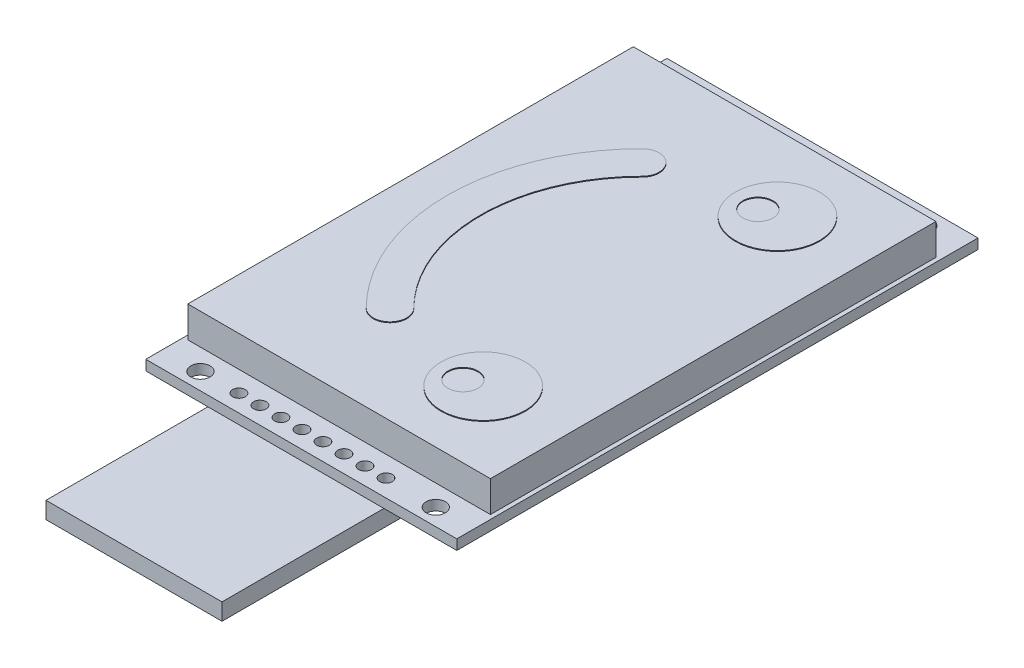
ISO-10303-21;
HEADER;
FILE_DESCRIPTION(('STEP AP214'),'2;1');
FILE_NAME('part.step','',(''),(''),'','','');
FILE_SCHEMA(('AUTOMOTIVE_DESIGN { 1 0 10303 214 1 1 1 1 }'));
ENDSEC;
DATA;
#1=APPLICATION_CONTEXT('core data for automotive mechanical design processes');
#2=APPLICATION_PROTOCOL_DEFINITION('international standard','automotive_design',2000,#1);
#3=PRODUCT_CONTEXT('',#1,'mechanical');
#4=PRODUCT('Part','Part','',(#3));
#5=PRODUCT_RELATED_PRODUCT_CATEGORY('part','',(#4));
#6=PRODUCT_DEFINITION_FORMATION('','',#4);
#7=PRODUCT_DEFINITION_CONTEXT('part definition',#1,'design');
#8=PRODUCT_DEFINITION('design','',#6,#7);
#9=PRODUCT_DEFINITION_SHAPE('','',#8);
#10=(LENGTH_UNIT() NAMED_UNIT(*) SI_UNIT(.MILLI.,.METRE.));
#11=(NAMED_UNIT(*) PLANE_ANGLE_UNIT() SI_UNIT($,.RADIAN.));
#12=(NAMED_UNIT(*) SI_UNIT($,.STERADIAN.) SOLID_ANGLE_UNIT());
#13=UNCERTAINTY_MEASURE_WITH_UNIT(LENGTH_MEASURE(1.E-05),#10,'distance_accuracy_value','');
#14=(GEOMETRIC_REPRESENTATION_CONTEXT(3) GLOBAL_UNCERTAINTY_ASSIGNED_CONTEXT((#13)) GLOBAL_UNIT_ASSIGNED_CONTEXT((#10,
#11,#12)) REPRESENTATION_CONTEXT('',''));
#15=CARTESIAN_POINT('',(0.,0.,0.));
#16=DIRECTION('',(0.,0.,1.));
#17=DIRECTION('',(1.,0.,0.));
#18=AXIS2_PLACEMENT_3D('',#15,#16,#17);
#19=CARTESIAN_POINT('',(0.,4.9,0.));
#20=DIRECTION('',(0.,1.,0.));
#21=DIRECTION('',(0.,0.,1.));
#22=AXIS2_PLACEMENT_3D('',#19,#20,#21);
#23=PLANE('',#22);
#24=CARTESIAN_POINT('',(26.6398842221222,4.9,-13.5));
#25=DIRECTION('',(0.,1.,0.));
#26=DIRECTION('',(0.,0.,1.));
#27=AXIS2_PLACEMENT_3D('',#24,#25,#26);
#28=CIRCLE('',#27,5.);
#29=CARTESIAN_POINT('',(26.6398842221222,4.9,-8.5));
#30=VERTEX_POINT('',#29);
#31=EDGE_CURVE('E216',#30,#30,#28,.T.);
#32=ORIENTED_EDGE('',*,*,#31,.F.);
#33=EDGE_LOOP('',(#32));
#34=FACE_BOUND('',#33,.T.);
#35=CARTESIAN_POINT('',(26.6398842221222,4.9,-48.5));
#36=DIRECTION('',(0.,1.,0.));
#37=DIRECTION('',(0.,0.,1.));
#38=AXIS2_PLACEMENT_3D('',#35,#36,#37);
#39=CIRCLE('',#38,5.);
#40=CARTESIAN_POINT('',(26.6398842221222,4.9,-43.5));
#41=VERTEX_POINT('',#40);
#42=EDGE_CURVE('E227',#41,#41,#39,.T.);
#43=ORIENTED_EDGE('',*,*,#42,.F.);
#44=EDGE_LOOP('',(#43));
#45=FACE_BOUND('',#44,.T.);
#46=DIRECTION('',(0.,0.,1.));
#47=VECTOR('',#46,1.);
#48=CARTESIAN_POINT('',(0.499999999999989,4.9,-57.5));
#49=LINE('',#48,#47);
#50=CARTESIAN_POINT('',(0.499999999999989,4.9,-57.5));
#51=VERTEX_POINT('',#50);
#52=CARTESIAN_POINT('',(0.500000000000007,4.9,-4.49999999999998));
#53=VERTEX_POINT('',#52);
#54=EDGE_CURVE('E282',#51,#53,#49,.T.);
#55=ORIENTED_EDGE('',*,*,#54,.T.);
#56=DIRECTION('',(1.,0.,0.));
#57=VECTOR('',#56,1.);
#58=CARTESIAN_POINT('',(0.500000000000007,4.9,-4.49999999999998));
#59=LINE('',#58,#57);
#60=CARTESIAN_POINT('',(36.5,4.9,-4.49999999999998));
#61=VERTEX_POINT('',#60);
#62=EDGE_CURVE('E285',#53,#61,#59,.T.);
#63=ORIENTED_EDGE('',*,*,#62,.T.);
#64=DIRECTION('',(0.,0.,-1.));
#65=VECTOR('',#64,1.);
#66=CARTESIAN_POINT('',(36.5,4.9,-57.5));
#67=LINE('',#66,#65);
#68=CARTESIAN_POINT('',(36.5,4.9,-57.5));
#69=VERTEX_POINT('',#68);
#70=EDGE_CURVE('E288',#61,#69,#67,.T.);
#71=ORIENTED_EDGE('',*,*,#70,.T.);
#72=DIRECTION('',(-1.,0.,0.));
#73=VECTOR('',#72,1.);
#74=CARTESIAN_POINT('',(0.499999999999989,4.9,-57.5));
#75=LINE('',#74,#73);
#76=EDGE_CURVE('E290',#69,#51,#75,.T.);
#77=ORIENTED_EDGE('',*,*,#76,.T.);
#78=EDGE_LOOP('',(#55,#63,#71,#77));
#79=FACE_BOUND('',#78,.T.);
#80=CARTESIAN_POINT('',(28.0543602032665,4.9,-31.));
#81=DIRECTION('',(0.,1.,0.));
#82=DIRECTION('',(0.,0.,1.));
#83=AXIS2_PLACEMENT_3D('',#80,#81,#82);
#84=CIRCLE('',#83,23.2132034355964);
#85=CARTESIAN_POINT('',(11.6401466408934,4.9,-47.4142135623731));
#86=VERTEX_POINT('',#85);
#87=CARTESIAN_POINT('',(11.6401466408934,4.9,-14.5857864376269));
#88=VERTEX_POINT('',#87);
#89=EDGE_CURVE('E203',#86,#88,#84,.T.);
#90=ORIENTED_EDGE('',*,*,#89,.F.);
#91=CARTESIAN_POINT('',(13.0543602032665,4.9,-46.));
#92=DIRECTION('',(0.,1.,0.));
#93=DIRECTION('',(0.,0.,1.));
#94=AXIS2_PLACEMENT_3D('',#91,#92,#93);
#95=CIRCLE('',#94,2.);
#96=CARTESIAN_POINT('',(14.4685737656396,4.9,-44.5857864376269));
#97=VERTEX_POINT('',#96);
#98=EDGE_CURVE('E205',#97,#86,#95,.T.);
#99=ORIENTED_EDGE('',*,*,#98,.F.);
#100=CARTESIAN_POINT('',(28.0543602032665,4.9,-31.));
#101=DIRECTION('',(0.,-1.,0.));
#102=DIRECTION('',(0.,0.,1.));
#103=AXIS2_PLACEMENT_3D('',#100,#101,#102);
#104=CIRCLE('',#103,19.2132034355964);
#105=CARTESIAN_POINT('',(14.4685737656396,4.9,-17.4142135623731));
#106=VERTEX_POINT('',#105);
#107=EDGE_CURVE('E197',#106,#97,#104,.T.);
#108=ORIENTED_EDGE('',*,*,#107,.F.);
#109=CARTESIAN_POINT('',(13.0543602032665,4.9,-16.));
#110=DIRECTION('',(0.,1.,0.));
#111=DIRECTION('',(0.,0.,-1.));
#112=AXIS2_PLACEMENT_3D('',#109,#110,#111);
#113=CIRCLE('',#112,2.);
#114=EDGE_CURVE('E199',#88,#106,#113,.T.);
#115=ORIENTED_EDGE('',*,*,#114,.F.);
#116=EDGE_LOOP('',(#90,#99,#108,#115));
#117=FACE_BOUND('',#116,.T.);
#118=ADVANCED_FACE('F39',(#34,#45,#79,#117),#23,.T.);
#119=CARTESIAN_POINT('',(0.,1.2,0.));
#120=DIRECTION('',(0.,-1.,0.));
#121=DIRECTION('',(0.,0.,-1.));
#122=AXIS2_PLACEMENT_3D('',#119,#120,#121);
#123=PLANE('',#122);
#124=CARTESIAN_POINT('',(9.03157835822631,1.2,-2.0506883751099));
#125=DIRECTION('',(0.,1.,0.));
#126=DIRECTION('',(0.,0.,1.));
#127=AXIS2_PLACEMENT_3D('',#124,#125,#126);
#128=CIRCLE('',#127,0.75);
#129=CARTESIAN_POINT('',(9.03157835822631,1.2,-1.3006883751099));
#130=VERTEX_POINT('',#129);
#131=EDGE_CURVE('E238',#130,#130,#128,.T.);
#132=ORIENTED_EDGE('',*,*,#131,.F.);
#133=EDGE_LOOP('',(#132));
#134=FACE_BOUND('',#133,.T.);
#135=CARTESIAN_POINT('',(11.5315783582263,1.2,-2.0506883751099));
#136=DIRECTION('',(0.,1.,0.));
#137=DIRECTION('',(0.,0.,1.));
#138=AXIS2_PLACEMENT_3D('',#135,#136,#137);
#139=CIRCLE('',#138,0.75);
#140=CARTESIAN_POINT('',(11.5315783582263,1.2,-1.3006883751099));
#141=VERTEX_POINT('',#140);
#142=EDGE_CURVE('E241',#141,#141,#139,.T.);
#143=ORIENTED_EDGE('',*,*,#142,.F.);
#144=EDGE_LOOP('',(#143));
#145=FACE_BOUND('',#144,.T.);
#146=CARTESIAN_POINT('',(14.0315783582263,1.2,-2.0506883751099));
#147=DIRECTION('',(0.,1.,0.));
#148=DIRECTION('',(0.,0.,1.));
#149=AXIS2_PLACEMENT_3D('',#146,#147,#148);
#150=CIRCLE('',#149,0.749999999999999);
#151=CARTESIAN_POINT('',(14.0315783582263,1.2,-1.30068837510991));
#152=VERTEX_POINT('',#151);
#153=EDGE_CURVE('E247',#152,#152,#150,.T.);
#154=ORIENTED_EDGE('',*,*,#153,.F.);
#155=EDGE_LOOP('',(#154));
#156=FACE_BOUND('',#155,.T.);
#157=CARTESIAN_POINT('',(16.5315783582263,1.2,-2.0506883751099));
#158=DIRECTION('',(0.,1.,0.));
#159=DIRECTION('',(0.,0.,1.));
#160=AXIS2_PLACEMENT_3D('',#157,#158,#159);
#161=CIRCLE('',#160,0.749999999999999);
#162=CARTESIAN_POINT('',(16.5315783582263,1.2,-1.30068837510991));
#163=VERTEX_POINT('',#162);
#164=EDGE_CURVE('E253',#163,#163,#161,.T.);
#165=ORIENTED_EDGE('',*,*,#164,.F.);
#166=EDGE_LOOP('',(#165));
#167=FACE_BOUND('',#166,.T.);
#168=CARTESIAN_POINT('',(19.0315783582263,1.2,-2.0506883751099));
#169=DIRECTION('',(0.,1.,0.));
#170=DIRECTION('',(0.,0.,1.));
#171=AXIS2_PLACEMENT_3D('',#168,#169,#170);
#172=CIRCLE('',#171,0.749999999999999);
#173=CARTESIAN_POINT('',(19.0315783582263,1.2,-1.30068837510991));
#174=VERTEX_POINT('',#173);
#175=EDGE_CURVE('E259',#174,#174,#172,.T.);
#176=ORIENTED_EDGE('',*,*,#175,.F.);
#177=EDGE_LOOP('',(#176));
#178=FACE_BOUND('',#177,.T.);
#179=CARTESIAN_POINT('',(21.5315783582263,1.2,-2.0506883751099));
#180=DIRECTION('',(0.,1.,0.));
#181=DIRECTION('',(0.,0.,1.));
#182=AXIS2_PLACEMENT_3D('',#179,#180,#181);
#183=CIRCLE('',#182,0.750000000000002);
#184=CARTESIAN_POINT('',(21.5315783582263,1.2,-1.3006883751099));
#185=VERTEX_POINT('',#184);
#186=EDGE_CURVE('E265',#185,#185,#183,.T.);
#187=ORIENTED_EDGE('',*,*,#186,.F.);
#188=EDGE_LOOP('',(#187));
#189=FACE_BOUND('',#188,.T.);
#190=CARTESIAN_POINT('',(24.0315783582263,1.2,-2.0506883751099));
#191=DIRECTION('',(0.,1.,0.));
#192=DIRECTION('',(0.,0.,1.));
#193=AXIS2_PLACEMENT_3D('',#190,#191,#192);
#194=CIRCLE('',#193,0.749999999999999);
#195=CARTESIAN_POINT('',(24.0315783582263,1.2,-1.30068837510991));
#196=VERTEX_POINT('',#195);
#197=EDGE_CURVE('E271',#196,#196,#194,.T.);
#198=ORIENTED_EDGE('',*,*,#197,.F.);
#199=EDGE_LOOP('',(#198));
#200=FACE_BOUND('',#199,.T.);
#201=CARTESIAN_POINT('',(26.5315783582263,1.2,-2.0506883751099));
#202=DIRECTION('',(0.,1.,0.));
#203=DIRECTION('',(0.,0.,1.));
#204=AXIS2_PLACEMENT_3D('',#201,#202,#203);
#205=CIRCLE('',#204,0.749999999999999);
#206=CARTESIAN_POINT('',(26.5315783582263,1.2,-1.30068837510991));
#207=VERTEX_POINT('',#206);
#208=EDGE_CURVE('E277',#207,#207,#205,.T.);
#209=ORIENTED_EDGE('',*,*,#208,.F.);
#210=EDGE_LOOP('',(#209));
#211=FACE_BOUND('',#210,.T.);
#212=CARTESIAN_POINT('',(4.50000000000001,1.2,-2.));
#213=DIRECTION('',(0.,1.,0.));
#214=DIRECTION('',(0.,0.,1.));
#215=AXIS2_PLACEMENT_3D('',#212,#213,#214);
#216=CIRCLE('',#215,1.15);
#217=CARTESIAN_POINT('',(4.50000000000001,1.2,-0.850000000000006));
#218=VERTEX_POINT('',#217);
#219=EDGE_CURVE('E315',#218,#218,#216,.T.);
#220=ORIENTED_EDGE('',*,*,#219,.F.);
#221=EDGE_LOOP('',(#220));
#222=FACE_BOUND('',#221,.T.);
#223=CARTESIAN_POINT('',(32.5,1.2,-2.00000000000001));
#224=DIRECTION('',(0.,1.,0.));
#225=DIRECTION('',(0.,0.,1.));
#226=AXIS2_PLACEMENT_3D('',#223,#224,#225);
#227=CIRCLE('',#226,1.15);
#228=CARTESIAN_POINT('',(32.5,1.2,-0.850000000000013));
#229=VERTEX_POINT('',#228);
#230=EDGE_CURVE('E321',#229,#229,#227,.T.);
#231=ORIENTED_EDGE('',*,*,#230,.F.);
#232=EDGE_LOOP('',(#231));
#233=FACE_BOUND('',#232,.T.);
#234=CARTESIAN_POINT('',(4.49999999999999,1.2,-60.));
#235=DIRECTION('',(0.,1.,0.));
#236=DIRECTION('',(0.,0.,1.));
#237=AXIS2_PLACEMENT_3D('',#234,#235,#236);
#238=CIRCLE('',#237,1.15);
#239=CARTESIAN_POINT('',(4.49999999999999,1.2,-58.85));
#240=VERTEX_POINT('',#239);
#241=EDGE_CURVE('E327',#240,#240,#238,.T.);
#242=ORIENTED_EDGE('',*,*,#241,.F.);
#243=EDGE_LOOP('',(#242));
#244=FACE_BOUND('',#243,.T.);
#245=CARTESIAN_POINT('',(32.5,1.2,-60.));
#246=DIRECTION('',(0.,1.,0.));
#247=DIRECTION('',(0.,0.,1.));
#248=AXIS2_PLACEMENT_3D('',#245,#246,#247);
#249=CIRCLE('',#248,1.15);
#250=CARTESIAN_POINT('',(32.5,1.2,-58.85));
#251=VERTEX_POINT('',#250);
#252=EDGE_CURVE('E333',#251,#251,#249,.T.);
#253=ORIENTED_EDGE('',*,*,#252,.F.);
#254=EDGE_LOOP('',(#253));
#255=FACE_BOUND('',#254,.T.);
#256=DIRECTION('',(0.,0.,1.));
#257=VECTOR('',#256,1.);
#258=CARTESIAN_POINT('',(0.,1.2,0.));
#259=LINE('',#258,#257);
#260=CARTESIAN_POINT('',(0.,1.2,-62.));
#261=VERTEX_POINT('',#260);
#262=CARTESIAN_POINT('',(0.,1.2,0.));
#263=VERTEX_POINT('',#262);
#264=EDGE_CURVE('E339',#261,#263,#259,.T.);
#265=ORIENTED_EDGE('',*,*,#264,.T.);
#266=DIRECTION('',(1.,0.,0.));
#267=VECTOR('',#266,1.);
#268=CARTESIAN_POINT('',(0.,1.2,0.));
#269=LINE('',#268,#267);
#270=CARTESIAN_POINT('',(37.,1.2,0.));
#271=VERTEX_POINT('',#270);
#272=EDGE_CURVE('E342',#263,#271,#269,.T.);
#273=ORIENTED_EDGE('',*,*,#272,.T.);
#274=DIRECTION('',(0.,0.,-1.));
#275=VECTOR('',#274,1.);
#276=CARTESIAN_POINT('',(37.,1.2,0.));
#277=LINE('',#276,#275);
#278=CARTESIAN_POINT('',(37.,1.2,-62.));
#279=VERTEX_POINT('',#278);
#280=EDGE_CURVE('E345',#271,#279,#277,.T.);
#281=ORIENTED_EDGE('',*,*,#280,.T.);
#282=DIRECTION('',(-1.,0.,0.));
#283=VECTOR('',#282,1.);
#284=CARTESIAN_POINT('',(0.,1.2,-62.));
#285=LINE('',#284,#283);
#286=EDGE_CURVE('E347',#279,#261,#285,.T.);
#287=ORIENTED_EDGE('',*,*,#286,.T.);
#288=EDGE_LOOP('',(#265,#273,#281,#287));
#289=FACE_BOUND('',#288,.T.);
#290=DIRECTION('',(0.,0.,1.));
#291=VECTOR('',#290,1.);
#292=CARTESIAN_POINT('',(0.499999999999989,1.2,-57.5));
#293=LINE('',#292,#291);
#294=CARTESIAN_POINT('',(0.499999999999989,1.2,-57.5));
#295=VERTEX_POINT('',#294);
#296=CARTESIAN_POINT('',(0.500000000000007,1.2,-4.49999999999998));
#297=VERTEX_POINT('',#296);
#298=EDGE_CURVE('E237',#295,#297,#293,.T.);
#299=ORIENTED_EDGE('',*,*,#298,.F.);
#300=DIRECTION('',(-1.,0.,0.));
#301=VECTOR('',#300,1.);
#302=CARTESIAN_POINT('',(0.499999999999989,1.2,-57.5));
#303=LINE('',#302,#301);
#304=CARTESIAN_POINT('',(36.5,1.2,-57.5));
#305=VERTEX_POINT('',#304);
#306=EDGE_CURVE('E286',#305,#295,#303,.T.);
#307=ORIENTED_EDGE('',*,*,#306,.F.);
#308=DIRECTION('',(0.,0.,-1.));
#309=VECTOR('',#308,1.);
#310=CARTESIAN_POINT('',(36.5,1.2,-57.5));
#311=LINE('',#310,#309);
#312=CARTESIAN_POINT('',(36.5,1.2,-4.49999999999998));
#313=VERTEX_POINT('',#312);
#314=EDGE_CURVE('E298',#313,#305,#311,.T.);
#315=ORIENTED_EDGE('',*,*,#314,.F.);
#316=DIRECTION('',(1.,0.,0.));
#317=VECTOR('',#316,1.);
#318=CARTESIAN_POINT('',(0.500000000000007,1.2,-4.49999999999998));
#319=LINE('',#318,#317);
#320=EDGE_CURVE('E295',#297,#313,#319,.T.);
#321=ORIENTED_EDGE('',*,*,#320,.F.);
#322=EDGE_LOOP('',(#299,#307,#315,#321));
#323=FACE_BOUND('',#322,.T.);
#324=ADVANCED_FACE('F400',(#134,#145,#156,#167,#178,#189,#200,#211,#222,#233,#244,#255,#289,
#323),#123,.F.);
#325=CARTESIAN_POINT('',(0.,0.,0.));
#326=DIRECTION('',(0.,-1.,0.));
#327=DIRECTION('',(0.,0.,-1.));
#328=AXIS2_PLACEMENT_3D('',#325,#326,#327);
#329=PLANE('',#328);
#330=DIRECTION('',(0.,0.,-1.));
#331=VECTOR('',#330,1.);
#332=CARTESIAN_POINT('',(7.39200473608774,0.,-4.49106444264418));
#333=LINE('',#332,#331);
#334=CARTESIAN_POINT('',(7.39200473608774,0.,0.));
#335=VERTEX_POINT('',#334);
#336=CARTESIAN_POINT('',(7.39200473608774,0.,-4.49106444264418));
#337=VERTEX_POINT('',#336);
#338=EDGE_CURVE('E11',#335,#337,#333,.T.);
#339=ORIENTED_EDGE('',*,*,#338,.F.);
#340=DIRECTION('',(1.,0.,0.));
#341=VECTOR('',#340,1.);
#342=CARTESIAN_POINT('',(0.,0.,0.));
#343=LINE('',#342,#341);
#344=CARTESIAN_POINT('',(0.,0.,0.));
#345=VERTEX_POINT('',#344);
#346=EDGE_CURVE('E352',#345,#335,#343,.T.);
#347=ORIENTED_EDGE('',*,*,#346,.F.);
#348=DIRECTION('',(0.,0.,1.));
#349=VECTOR('',#348,1.);
#350=CARTESIAN_POINT('',(0.,0.,0.));
#351=LINE('',#350,#349);
#352=CARTESIAN_POINT('',(0.,0.,-62.));
#353=VERTEX_POINT('',#352);
#354=EDGE_CURVE('E336',#353,#345,#351,.T.);
#355=ORIENTED_EDGE('',*,*,#354,.F.);
#356=DIRECTION('',(-1.,0.,0.));
#357=VECTOR('',#356,1.);
#358=CARTESIAN_POINT('',(0.,0.,-62.));
#359=LINE('',#358,#357);
#360=CARTESIAN_POINT('',(37.,0.,-62.));
#361=VERTEX_POINT('',#360);
#362=EDGE_CURVE('E343',#361,#353,#359,.T.);
#363=ORIENTED_EDGE('',*,*,#362,.F.);
#364=DIRECTION('',(0.,0.,-1.));
#365=VECTOR('',#364,1.);
#366=CARTESIAN_POINT('',(37.,0.,0.));
#367=LINE('',#366,#365);
#368=CARTESIAN_POINT('',(37.,0.,0.));
#369=VERTEX_POINT('',#368);
#370=EDGE_CURVE('E355',#369,#361,#367,.T.);
#371=ORIENTED_EDGE('',*,*,#370,.F.);
#372=CARTESIAN_POINT('',(28.3291269396149,0.,0.));
#373=VERTEX_POINT('',#372);
#374=EDGE_CURVE('E61',#373,#369,#343,.T.);
#375=ORIENTED_EDGE('',*,*,#374,.F.);
#376=DIRECTION('',(0.,0.,1.));
#377=VECTOR('',#376,1.);
#378=CARTESIAN_POINT('',(28.3291269396149,0.,-4.49106444264418));
#379=LINE('',#378,#377);
#380=CARTESIAN_POINT('',(28.3291269396149,0.,-4.49106444264418));
#381=VERTEX_POINT('',#380);
#382=EDGE_CURVE('E577',#381,#373,#379,.T.);
#383=ORIENTED_EDGE('',*,*,#382,.F.);
#384=DIRECTION('',(1.,0.,0.));
#385=VECTOR('',#384,1.);
#386=CARTESIAN_POINT('',(7.39200473608774,0.,-4.49106444264418));
#387=LINE('',#386,#385);
#388=EDGE_CURVE('E56',#337,#381,#387,.T.);
#389=ORIENTED_EDGE('',*,*,#388,.F.);
#390=EDGE_LOOP('',(#339,#347,#355,#363,#371,#375,#383,#389));
#391=FACE_BOUND('',#390,.T.);
#392=CARTESIAN_POINT('',(32.5,0.,-2.00000000000001));
#393=DIRECTION('',(0.,1.,0.));
#394=DIRECTION('',(0.,0.,1.));
#395=AXIS2_PLACEMENT_3D('',#392,#393,#394);
#396=CIRCLE('',#395,1.15);
#397=CARTESIAN_POINT('',(32.5,0.,-0.850000000000013));
#398=VERTEX_POINT('',#397);
#399=EDGE_CURVE('E318',#398,#398,#396,.T.);
#400=ORIENTED_EDGE('',*,*,#399,.T.);
#401=EDGE_LOOP('',(#400));
#402=FACE_BOUND('',#401,.T.);
#403=CARTESIAN_POINT('',(32.5,0.,-60.));
#404=DIRECTION('',(0.,1.,0.));
#405=DIRECTION('',(0.,0.,1.));
#406=AXIS2_PLACEMENT_3D('',#403,#404,#405);
#407=CIRCLE('',#406,1.15);
#408=CARTESIAN_POINT('',(32.5,0.,-58.85));
#409=VERTEX_POINT('',#408);
#410=EDGE_CURVE('E330',#409,#409,#407,.T.);
#411=ORIENTED_EDGE('',*,*,#410,.T.);
#412=EDGE_LOOP('',(#411));
#413=FACE_BOUND('',#412,.T.);
#414=CARTESIAN_POINT('',(4.49999999999999,0.,-60.));
#415=DIRECTION('',(0.,1.,0.));
#416=DIRECTION('',(0.,0.,1.));
#417=AXIS2_PLACEMENT_3D('',#414,#415,#416);
#418=CIRCLE('',#417,1.15);
#419=CARTESIAN_POINT('',(4.49999999999999,0.,-58.85));
#420=VERTEX_POINT('',#419);
#421=EDGE_CURVE('E324',#420,#420,#418,.T.);
#422=ORIENTED_EDGE('',*,*,#421,.T.);
#423=EDGE_LOOP('',(#422));
#424=FACE_BOUND('',#423,.T.);
#425=CARTESIAN_POINT('',(4.50000000000001,0.,-2.));
#426=DIRECTION('',(0.,1.,0.));
#427=DIRECTION('',(0.,0.,1.));
#428=AXIS2_PLACEMENT_3D('',#425,#426,#427);
#429=CIRCLE('',#428,1.15);
#430=CARTESIAN_POINT('',(4.50000000000001,0.,-0.850000000000006));
#431=VERTEX_POINT('',#430);
#432=EDGE_CURVE('E314',#431,#431,#429,.T.);
#433=ORIENTED_EDGE('',*,*,#432,.T.);
#434=EDGE_LOOP('',(#433));
#435=FACE_BOUND('',#434,.T.);
#436=ADVANCED_FACE('F405',(#391,#402,#413,#424,#435),#329,.T.);
#437=CARTESIAN_POINT('',(0.,1.2,0.));
#438=DIRECTION('',(1.,0.,0.));
#439=DIRECTION('',(0.,0.,-1.));
#440=AXIS2_PLACEMENT_3D('',#437,#438,#439);
#441=PLANE('',#440);
#442=ORIENTED_EDGE('',*,*,#354,.T.);
#443=DIRECTION('',(0.,-1.,0.));
#444=VECTOR('',#443,1.);
#445=CARTESIAN_POINT('',(0.,1.2,0.));
#446=LINE('',#445,#444);
#447=EDGE_CURVE('E367',#263,#345,#446,.T.);
#448=ORIENTED_EDGE('',*,*,#447,.F.);
#449=ORIENTED_EDGE('',*,*,#264,.F.);
#450=DIRECTION('',(0.,-1.,0.));
#451=VECTOR('',#450,1.);
#452=CARTESIAN_POINT('',(0.,1.2,-62.));
#453=LINE('',#452,#451);
#454=EDGE_CURVE('E349',#261,#353,#453,.T.);
#455=ORIENTED_EDGE('',*,*,#454,.T.);
#456=EDGE_LOOP('',(#442,#448,#449,#455));
#457=FACE_BOUND('',#456,.T.);
#458=ADVANCED_FACE('F41',(#457),#441,.F.);
#459=CARTESIAN_POINT('',(0.,1.2,0.));
#460=DIRECTION('',(0.,0.,-1.));
#461=DIRECTION('',(-1.,0.,0.));
#462=AXIS2_PLACEMENT_3D('',#459,#460,#461);
#463=PLANE('',#462);
#464=ORIENTED_EDGE('',*,*,#346,.T.);
#465=EDGE_CURVE('E356',#335,#373,#343,.T.);
#466=ORIENTED_EDGE('',*,*,#465,.T.);
#467=ORIENTED_EDGE('',*,*,#374,.T.);
#468=DIRECTION('',(0.,-1.,0.));
#469=VECTOR('',#468,1.);
#470=CARTESIAN_POINT('',(37.,1.2,0.));
#471=LINE('',#470,#469);
#472=EDGE_CURVE('E364',#271,#369,#471,.T.);
#473=ORIENTED_EDGE('',*,*,#472,.F.);
#474=ORIENTED_EDGE('',*,*,#272,.F.);
#475=ORIENTED_EDGE('',*,*,#447,.T.);
#476=EDGE_LOOP('',(#464,#466,#467,#473,#474,#475));
#477=FACE_BOUND('',#476,.T.);
#478=ADVANCED_FACE('F555',(#477),#463,.F.);
#479=CARTESIAN_POINT('',(37.,1.2,0.));
#480=DIRECTION('',(-1.,0.,0.));
#481=DIRECTION('',(0.,0.,1.));
#482=AXIS2_PLACEMENT_3D('',#479,#480,#481);
#483=PLANE('',#482);
#484=ORIENTED_EDGE('',*,*,#370,.T.);
#485=DIRECTION('',(0.,-1.,0.));
#486=VECTOR('',#485,1.);
#487=CARTESIAN_POINT('',(37.,1.2,-62.));
#488=LINE('',#487,#486);
#489=EDGE_CURVE('E361',#279,#361,#488,.T.);
#490=ORIENTED_EDGE('',*,*,#489,.F.);
#491=ORIENTED_EDGE('',*,*,#280,.F.);
#492=ORIENTED_EDGE('',*,*,#472,.T.);
#493=EDGE_LOOP('',(#484,#490,#491,#492));
#494=FACE_BOUND('',#493,.T.);
#495=ADVANCED_FACE('F552',(#494),#483,.F.);
#496=CARTESIAN_POINT('',(0.,1.2,-62.));
#497=DIRECTION('',(0.,0.,1.));
#498=DIRECTION('',(1.,0.,0.));
#499=AXIS2_PLACEMENT_3D('',#496,#497,#498);
#500=PLANE('',#499);
#501=ORIENTED_EDGE('',*,*,#362,.T.);
#502=ORIENTED_EDGE('',*,*,#454,.F.);
#503=ORIENTED_EDGE('',*,*,#286,.F.);
#504=ORIENTED_EDGE('',*,*,#489,.T.);
#505=EDGE_LOOP('',(#501,#502,#503,#504));
#506=FACE_BOUND('',#505,.T.);
#507=ADVANCED_FACE('F545',(#506),#500,.F.);
#508=CARTESIAN_POINT('',(32.5,1.2,-60.));
#509=DIRECTION('',(0.,-1.,0.));
#510=DIRECTION('',(0.,0.,-1.));
#511=AXIS2_PLACEMENT_3D('',#508,#509,#510);
#512=CYLINDRICAL_SURFACE('',#511,1.15);
#513=ORIENTED_EDGE('',*,*,#252,.T.);
#514=EDGE_LOOP('',(#513));
#515=FACE_BOUND('',#514,.T.);
#516=ORIENTED_EDGE('',*,*,#410,.F.);
#517=EDGE_LOOP('',(#516));
#518=FACE_BOUND('',#517,.T.);
#519=ADVANCED_FACE('F542',(#515,#518),#512,.F.);
#520=CARTESIAN_POINT('',(4.49999999999999,1.2,-60.));
#521=DIRECTION('',(0.,-1.,0.));
#522=DIRECTION('',(0.,0.,-1.));
#523=AXIS2_PLACEMENT_3D('',#520,#521,#522);
#524=CYLINDRICAL_SURFACE('',#523,1.15);
#525=ORIENTED_EDGE('',*,*,#241,.T.);
#526=EDGE_LOOP('',(#525));
#527=FACE_BOUND('',#526,.T.);
#528=ORIENTED_EDGE('',*,*,#421,.F.);
#529=EDGE_LOOP('',(#528));
#530=FACE_BOUND('',#529,.T.);
#531=ADVANCED_FACE('F538',(#527,#530),#524,.F.);
#532=CARTESIAN_POINT('',(32.5,1.2,-2.00000000000001));
#533=DIRECTION('',(0.,-1.,0.));
#534=DIRECTION('',(0.,0.,-1.));
#535=AXIS2_PLACEMENT_3D('',#532,#533,#534);
#536=CYLINDRICAL_SURFACE('',#535,1.15);
#537=ORIENTED_EDGE('',*,*,#230,.T.);
#538=EDGE_LOOP('',(#537));
#539=FACE_BOUND('',#538,.T.);
#540=ORIENTED_EDGE('',*,*,#399,.F.);
#541=EDGE_LOOP('',(#540));
#542=FACE_BOUND('',#541,.T.);
#543=ADVANCED_FACE('F534',(#539,#542),#536,.F.);
#544=CARTESIAN_POINT('',(4.50000000000001,1.2,-2.));
#545=DIRECTION('',(0.,-1.,0.));
#546=DIRECTION('',(0.,0.,-1.));
#547=AXIS2_PLACEMENT_3D('',#544,#545,#546);
#548=CYLINDRICAL_SURFACE('',#547,1.15);
#549=ORIENTED_EDGE('',*,*,#219,.T.);
#550=EDGE_LOOP('',(#549));
#551=FACE_BOUND('',#550,.T.);
#552=ORIENTED_EDGE('',*,*,#432,.F.);
#553=EDGE_LOOP('',(#552));
#554=FACE_BOUND('',#553,.T.);
#555=ADVANCED_FACE('F531',(#551,#554),#548,.F.);
#556=CARTESIAN_POINT('',(0.499999999999989,4.9,-57.5));
#557=DIRECTION('',(1.,0.,0.));
#558=DIRECTION('',(0.,0.,-1.));
#559=AXIS2_PLACEMENT_3D('',#556,#557,#558);
#560=PLANE('',#559);
#561=ORIENTED_EDGE('',*,*,#298,.T.);
#562=DIRECTION('',(0.,-1.,0.));
#563=VECTOR('',#562,1.);
#564=CARTESIAN_POINT('',(0.500000000000007,4.9,-4.49999999999998));
#565=LINE('',#564,#563);
#566=EDGE_CURVE('E311',#53,#297,#565,.T.);
#567=ORIENTED_EDGE('',*,*,#566,.F.);
#568=ORIENTED_EDGE('',*,*,#54,.F.);
#569=DIRECTION('',(0.,-1.,0.));
#570=VECTOR('',#569,1.);
#571=CARTESIAN_POINT('',(0.499999999999989,4.9,-57.5));
#572=LINE('',#571,#570);
#573=EDGE_CURVE('E292',#51,#295,#572,.T.);
#574=ORIENTED_EDGE('',*,*,#573,.T.);
#575=EDGE_LOOP('',(#561,#567,#568,#574));
#576=FACE_BOUND('',#575,.T.);
#577=ADVANCED_FACE('F516',(#576),#560,.F.);
#578=CARTESIAN_POINT('',(0.500000000000007,4.9,-4.49999999999998));
#579=DIRECTION('',(0.,0.,-1.));
#580=DIRECTION('',(-1.,0.,0.));
#581=AXIS2_PLACEMENT_3D('',#578,#579,#580);
#582=PLANE('',#581);
#583=ORIENTED_EDGE('',*,*,#320,.T.);
#584=DIRECTION('',(0.,-1.,0.));
#585=VECTOR('',#584,1.);
#586=CARTESIAN_POINT('',(36.5,4.9,-4.49999999999998));
#587=LINE('',#586,#585);
#588=EDGE_CURVE('E308',#61,#313,#587,.T.);
#589=ORIENTED_EDGE('',*,*,#588,.F.);
#590=ORIENTED_EDGE('',*,*,#62,.F.);
#591=ORIENTED_EDGE('',*,*,#566,.T.);
#592=EDGE_LOOP('',(#583,#589,#590,#591));
#593=FACE_BOUND('',#592,.T.);
#594=ADVANCED_FACE('F518',(#593),#582,.F.);
#595=CARTESIAN_POINT('',(36.5,4.9,-57.5));
#596=DIRECTION('',(-1.,0.,0.));
#597=DIRECTION('',(0.,0.,1.));
#598=AXIS2_PLACEMENT_3D('',#595,#596,#597);
#599=PLANE('',#598);
#600=ORIENTED_EDGE('',*,*,#314,.T.);
#601=DIRECTION('',(0.,-1.,0.));
#602=VECTOR('',#601,1.);
#603=CARTESIAN_POINT('',(36.5,4.9,-57.5));
#604=LINE('',#603,#602);
#605=EDGE_CURVE('E305',#69,#305,#604,.T.);
#606=ORIENTED_EDGE('',*,*,#605,.F.);
#607=ORIENTED_EDGE('',*,*,#70,.F.);
#608=ORIENTED_EDGE('',*,*,#588,.T.);
#609=EDGE_LOOP('',(#600,#606,#607,#608));
#610=FACE_BOUND('',#609,.T.);
#611=ADVANCED_FACE('F494',(#610),#599,.F.);
#612=CARTESIAN_POINT('',(0.499999999999989,4.9,-57.5));
#613=DIRECTION('',(0.,0.,1.));
#614=DIRECTION('',(1.,0.,0.));
#615=AXIS2_PLACEMENT_3D('',#612,#613,#614);
#616=PLANE('',#615);
#617=ORIENTED_EDGE('',*,*,#306,.T.);
#618=ORIENTED_EDGE('',*,*,#573,.F.);
#619=ORIENTED_EDGE('',*,*,#76,.F.);
#620=ORIENTED_EDGE('',*,*,#605,.T.);
#621=EDGE_LOOP('',(#617,#618,#619,#620));
#622=FACE_BOUND('',#621,.T.);
#623=ADVANCED_FACE('F489',(#622),#616,.F.);
#624=CARTESIAN_POINT('',(26.5315783582263,0.,-2.0506883751099));
#625=DIRECTION('',(0.,1.,0.));
#626=DIRECTION('',(0.,0.,1.));
#627=AXIS2_PLACEMENT_3D('',#624,#625,#626);
#628=CYLINDRICAL_SURFACE('',#627,0.749999999999999);
#629=CARTESIAN_POINT('',(26.5315783582263,0.,-2.0506883751099));
#630=DIRECTION('',(0.,1.,0.));
#631=DIRECTION('',(0.,0.,1.));
#632=AXIS2_PLACEMENT_3D('',#629,#630,#631);
#633=CIRCLE('',#632,0.749999999999999);
#634=CARTESIAN_POINT('',(26.5315783582263,0.,-1.30068837510991));
#635=VERTEX_POINT('',#634);
#636=EDGE_CURVE('E231',#635,#635,#633,.T.);
#637=ORIENTED_EDGE('',*,*,#636,.F.);
#638=EDGE_LOOP('',(#637));
#639=FACE_BOUND('',#638,.T.);
#640=ORIENTED_EDGE('',*,*,#208,.T.);
#641=EDGE_LOOP('',(#640));
#642=FACE_BOUND('',#641,.T.);
#643=ADVANCED_FACE('F486',(#639,#642),#628,.F.);
#644=CARTESIAN_POINT('',(24.0315783582263,0.,-2.0506883751099));
#645=DIRECTION('',(0.,1.,0.));
#646=DIRECTION('',(0.,0.,1.));
#647=AXIS2_PLACEMENT_3D('',#644,#645,#646);
#648=CYLINDRICAL_SURFACE('',#647,0.749999999999999);
#649=CARTESIAN_POINT('',(24.0315783582263,0.,-2.0506883751099));
#650=DIRECTION('',(0.,1.,0.));
#651=DIRECTION('',(0.,0.,1.));
#652=AXIS2_PLACEMENT_3D('',#649,#650,#651);
#653=CIRCLE('',#652,0.749999999999999);
#654=CARTESIAN_POINT('',(24.0315783582263,0.,-1.30068837510991));
#655=VERTEX_POINT('',#654);
#656=EDGE_CURVE('E274',#655,#655,#653,.T.);
#657=ORIENTED_EDGE('',*,*,#656,.F.);
#658=EDGE_LOOP('',(#657));
#659=FACE_BOUND('',#658,.T.);
#660=ORIENTED_EDGE('',*,*,#197,.T.);
#661=EDGE_LOOP('',(#660));
#662=FACE_BOUND('',#661,.T.);
#663=ADVANCED_FACE('F483',(#659,#662),#648,.F.);
#664=CARTESIAN_POINT('',(21.5315783582263,0.,-2.0506883751099));
#665=DIRECTION('',(0.,1.,0.));
#666=DIRECTION('',(0.,0.,1.));
#667=AXIS2_PLACEMENT_3D('',#664,#665,#666);
#668=CYLINDRICAL_SURFACE('',#667,0.750000000000002);
#669=CARTESIAN_POINT('',(21.5315783582263,0.,-2.0506883751099));
#670=DIRECTION('',(0.,1.,0.));
#671=DIRECTION('',(0.,0.,1.));
#672=AXIS2_PLACEMENT_3D('',#669,#670,#671);
#673=CIRCLE('',#672,0.750000000000002);
#674=CARTESIAN_POINT('',(21.5315783582263,0.,-1.3006883751099));
#675=VERTEX_POINT('',#674);
#676=EDGE_CURVE('E268',#675,#675,#673,.T.);
#677=ORIENTED_EDGE('',*,*,#676,.F.);
#678=EDGE_LOOP('',(#677));
#679=FACE_BOUND('',#678,.T.);
#680=ORIENTED_EDGE('',*,*,#186,.T.);
#681=EDGE_LOOP('',(#680));
#682=FACE_BOUND('',#681,.T.);
#683=ADVANCED_FACE('F479',(#679,#682),#668,.F.);
#684=CARTESIAN_POINT('',(19.0315783582263,0.,-2.0506883751099));
#685=DIRECTION('',(0.,1.,0.));
#686=DIRECTION('',(0.,0.,1.));
#687=AXIS2_PLACEMENT_3D('',#684,#685,#686);
#688=CYLINDRICAL_SURFACE('',#687,0.749999999999999);
#689=CARTESIAN_POINT('',(19.0315783582263,0.,-2.0506883751099));
#690=DIRECTION('',(0.,1.,0.));
#691=DIRECTION('',(0.,0.,1.));
#692=AXIS2_PLACEMENT_3D('',#689,#690,#691);
#693=CIRCLE('',#692,0.749999999999999);
#694=CARTESIAN_POINT('',(19.0315783582263,0.,-1.30068837510991));
#695=VERTEX_POINT('',#694);
#696=EDGE_CURVE('E262',#695,#695,#693,.T.);
#697=ORIENTED_EDGE('',*,*,#696,.F.);
#698=EDGE_LOOP('',(#697));
#699=FACE_BOUND('',#698,.T.);
#700=ORIENTED_EDGE('',*,*,#175,.T.);
#701=EDGE_LOOP('',(#700));
#702=FACE_BOUND('',#701,.T.);
#703=ADVANCED_FACE('F475',(#699,#702),#688,.F.);
#704=CARTESIAN_POINT('',(16.5315783582263,0.,-2.0506883751099));
#705=DIRECTION('',(0.,1.,0.));
#706=DIRECTION('',(0.,0.,1.));
#707=AXIS2_PLACEMENT_3D('',#704,#705,#706);
#708=CYLINDRICAL_SURFACE('',#707,0.749999999999999);
#709=CARTESIAN_POINT('',(16.5315783582263,0.,-2.0506883751099));
#710=DIRECTION('',(0.,1.,0.));
#711=DIRECTION('',(0.,0.,1.));
#712=AXIS2_PLACEMENT_3D('',#709,#710,#711);
#713=CIRCLE('',#712,0.749999999999999);
#714=CARTESIAN_POINT('',(16.5315783582263,0.,-1.30068837510991));
#715=VERTEX_POINT('',#714);
#716=EDGE_CURVE('E256',#715,#715,#713,.T.);
#717=ORIENTED_EDGE('',*,*,#716,.F.);
#718=EDGE_LOOP('',(#717));
#719=FACE_BOUND('',#718,.T.);
#720=ORIENTED_EDGE('',*,*,#164,.T.);
#721=EDGE_LOOP('',(#720));
#722=FACE_BOUND('',#721,.T.);
#723=ADVANCED_FACE('F471',(#719,#722),#708,.F.);
#724=CARTESIAN_POINT('',(14.0315783582263,0.,-2.0506883751099));
#725=DIRECTION('',(0.,1.,0.));
#726=DIRECTION('',(0.,0.,1.));
#727=AXIS2_PLACEMENT_3D('',#724,#725,#726);
#728=CYLINDRICAL_SURFACE('',#727,0.749999999999999);
#729=CARTESIAN_POINT('',(14.0315783582263,0.,-2.0506883751099));
#730=DIRECTION('',(0.,1.,0.));
#731=DIRECTION('',(0.,0.,1.));
#732=AXIS2_PLACEMENT_3D('',#729,#730,#731);
#733=CIRCLE('',#732,0.749999999999999);
#734=CARTESIAN_POINT('',(14.0315783582263,0.,-1.30068837510991));
#735=VERTEX_POINT('',#734);
#736=EDGE_CURVE('E250',#735,#735,#733,.T.);
#737=ORIENTED_EDGE('',*,*,#736,.F.);
#738=EDGE_LOOP('',(#737));
#739=FACE_BOUND('',#738,.T.);
#740=ORIENTED_EDGE('',*,*,#153,.T.);
#741=EDGE_LOOP('',(#740));
#742=FACE_BOUND('',#741,.T.);
#743=ADVANCED_FACE('F467',(#739,#742),#728,.F.);
#744=CARTESIAN_POINT('',(11.5315783582263,0.,-2.0506883751099));
#745=DIRECTION('',(0.,1.,0.));
#746=DIRECTION('',(0.,0.,1.));
#747=AXIS2_PLACEMENT_3D('',#744,#745,#746);
#748=CYLINDRICAL_SURFACE('',#747,0.75);
#749=CARTESIAN_POINT('',(11.5315783582263,0.,-2.0506883751099));
#750=DIRECTION('',(0.,1.,0.));
#751=DIRECTION('',(0.,0.,1.));
#752=AXIS2_PLACEMENT_3D('',#749,#750,#751);
#753=CIRCLE('',#752,0.75);
#754=CARTESIAN_POINT('',(11.5315783582263,0.,-1.3006883751099));
#755=VERTEX_POINT('',#754);
#756=EDGE_CURVE('E244',#755,#755,#753,.T.);
#757=ORIENTED_EDGE('',*,*,#756,.F.);
#758=EDGE_LOOP('',(#757));
#759=FACE_BOUND('',#758,.T.);
#760=ORIENTED_EDGE('',*,*,#142,.T.);
#761=EDGE_LOOP('',(#760));
#762=FACE_BOUND('',#761,.T.);
#763=ADVANCED_FACE('F463',(#759,#762),#748,.F.);
#764=CARTESIAN_POINT('',(9.03157835822631,0.,-2.0506883751099));
#765=DIRECTION('',(0.,1.,0.));
#766=DIRECTION('',(0.,0.,1.));
#767=AXIS2_PLACEMENT_3D('',#764,#765,#766);
#768=CYLINDRICAL_SURFACE('',#767,0.75);
#769=CARTESIAN_POINT('',(9.03157835822631,0.,-2.0506883751099));
#770=DIRECTION('',(0.,1.,0.));
#771=DIRECTION('',(0.,0.,1.));
#772=AXIS2_PLACEMENT_3D('',#769,#770,#771);
#773=CIRCLE('',#772,0.75);
#774=CARTESIAN_POINT('',(9.03157835822631,0.,-1.3006883751099));
#775=VERTEX_POINT('',#774);
#776=EDGE_CURVE('E234',#775,#775,#773,.T.);
#777=ORIENTED_EDGE('',*,*,#776,.F.);
#778=EDGE_LOOP('',(#777));
#779=FACE_BOUND('',#778,.T.);
#780=ORIENTED_EDGE('',*,*,#131,.T.);
#781=EDGE_LOOP('',(#780));
#782=FACE_BOUND('',#781,.T.);
#783=ADVANCED_FACE('F456',(#779,#782),#768,.F.);
#784=CARTESIAN_POINT('',(26.6398842221222,5.,-48.5));
#785=DIRECTION('',(0.,1.,0.));
#786=DIRECTION('',(0.,0.,1.));
#787=AXIS2_PLACEMENT_3D('',#784,#785,#786);
#788=PLANE('',#787);
#789=CARTESIAN_POINT('',(26.6398842221222,5.,-48.5));
#790=DIRECTION('',(0.,1.,0.));
#791=DIRECTION('',(0.,0.,1.));
#792=AXIS2_PLACEMENT_3D('',#789,#790,#791);
#793=CIRCLE('',#792,5.);
#794=CARTESIAN_POINT('',(26.6398842221222,5.,-43.5));
#795=VERTEX_POINT('',#794);
#796=EDGE_CURVE('E228',#795,#795,#793,.T.);
#797=ORIENTED_EDGE('',*,*,#796,.T.);
#798=EDGE_LOOP('',(#797));
#799=FACE_BOUND('',#798,.T.);
#800=CARTESIAN_POINT('',(24.7633000751166,5.,-48.0581553168028));
#801=DIRECTION('',(0.,1.,0.));
#802=DIRECTION('',(0.,0.,1.));
#803=AXIS2_PLACEMENT_3D('',#800,#801,#802);
#804=CIRCLE('',#803,1.78605317358017);
#805=CARTESIAN_POINT('',(24.7633000751166,5.,-46.2721021432226));
#806=VERTEX_POINT('',#805);
#807=EDGE_CURVE('E224',#806,#806,#804,.T.);
#808=ORIENTED_EDGE('',*,*,#807,.F.);
#809=EDGE_LOOP('',(#808));
#810=FACE_BOUND('',#809,.T.);
#811=ADVANCED_FACE('F453',(#799,#810),#788,.T.);
#812=CARTESIAN_POINT('',(26.6398842221222,5.,-48.5));
#813=DIRECTION('',(0.,-1.,0.));
#814=DIRECTION('',(0.,0.,-1.));
#815=AXIS2_PLACEMENT_3D('',#812,#813,#814);
#816=CYLINDRICAL_SURFACE('',#815,5.);
#817=ORIENTED_EDGE('',*,*,#796,.F.);
#818=EDGE_LOOP('',(#817));
#819=FACE_BOUND('',#818,.T.);
#820=ORIENTED_EDGE('',*,*,#42,.T.);
#821=EDGE_LOOP('',(#820));
#822=FACE_BOUND('',#821,.T.);
#823=ADVANCED_FACE('F451',(#819,#822),#816,.T.);
#824=CARTESIAN_POINT('',(24.7633000751166,5.,-48.0581553168028));
#825=DIRECTION('',(0.,-1.,0.));
#826=DIRECTION('',(0.,0.,-1.));
#827=AXIS2_PLACEMENT_3D('',#824,#825,#826);
#828=CYLINDRICAL_SURFACE('',#827,1.78605317358017);
#829=ORIENTED_EDGE('',*,*,#807,.T.);
#830=EDGE_LOOP('',(#829));
#831=FACE_BOUND('',#830,.T.);
#832=CARTESIAN_POINT('',(24.7633000751166,4.9,-48.0581553168028));
#833=DIRECTION('',(0.,1.,0.));
#834=DIRECTION('',(0.,0.,1.));
#835=AXIS2_PLACEMENT_3D('',#832,#833,#834);
#836=CIRCLE('',#835,1.78605317358017);
#837=CARTESIAN_POINT('',(24.7633000751166,4.9,-46.2721021432226));
#838=VERTEX_POINT('',#837);
#839=EDGE_CURVE('E369',#838,#838,#836,.F.);
#840=ORIENTED_EDGE('',*,*,#839,.T.);
#841=EDGE_LOOP('',(#840));
#842=FACE_BOUND('',#841,.T.);
#843=ADVANCED_FACE('F397',(#831,#842),#828,.F.);
#844=ORIENTED_EDGE('',*,*,#839,.F.);
#845=EDGE_LOOP('',(#844));
#846=FACE_BOUND('',#845,.T.);
#847=ADVANCED_FACE('F382',(#846),#23,.T.);
#848=CARTESIAN_POINT('',(26.6398842221222,5.,-13.5));
#849=DIRECTION('',(0.,1.,0.));
#850=DIRECTION('',(0.,0.,1.));
#851=AXIS2_PLACEMENT_3D('',#848,#849,#850);
#852=PLANE('',#851);
#853=CARTESIAN_POINT('',(26.6398842221222,5.,-13.5));
#854=DIRECTION('',(0.,1.,0.));
#855=DIRECTION('',(0.,0.,1.));
#856=AXIS2_PLACEMENT_3D('',#853,#854,#855);
#857=CIRCLE('',#856,5.);
#858=CARTESIAN_POINT('',(26.6398842221222,5.,-8.5));
#859=VERTEX_POINT('',#858);
#860=EDGE_CURVE('E208',#859,#859,#857,.T.);
#861=ORIENTED_EDGE('',*,*,#860,.T.);
#862=EDGE_LOOP('',(#861));
#863=FACE_BOUND('',#862,.T.);
#864=CARTESIAN_POINT('',(24.7633000751166,5.,-12.9716855793918));
#865=DIRECTION('',(0.,1.,0.));
#866=DIRECTION('',(0.,0.,1.));
#867=AXIS2_PLACEMENT_3D('',#864,#865,#866);
#868=CIRCLE('',#867,1.78605317358017);
#869=CARTESIAN_POINT('',(24.7633000751166,5.,-11.1856324058116));
#870=VERTEX_POINT('',#869);
#871=EDGE_CURVE('E219',#870,#870,#868,.T.);
#872=ORIENTED_EDGE('',*,*,#871,.F.);
#873=EDGE_LOOP('',(#872));
#874=FACE_BOUND('',#873,.T.);
#875=ADVANCED_FACE('F396',(#863,#874),#852,.T.);
#876=CARTESIAN_POINT('',(26.6398842221222,5.,-13.5));
#877=DIRECTION('',(0.,-1.,0.));
#878=DIRECTION('',(0.,0.,-1.));
#879=AXIS2_PLACEMENT_3D('',#876,#877,#878);
#880=CYLINDRICAL_SURFACE('',#879,5.);
#881=ORIENTED_EDGE('',*,*,#860,.F.);
#882=EDGE_LOOP('',(#881));
#883=FACE_BOUND('',#882,.T.);
#884=ORIENTED_EDGE('',*,*,#31,.T.);
#885=EDGE_LOOP('',(#884));
#886=FACE_BOUND('',#885,.T.);
#887=ADVANCED_FACE('F390',(#883,#886),#880,.T.);
#888=CARTESIAN_POINT('',(24.7633000751166,5.,-12.9716855793918));
#889=DIRECTION('',(0.,-1.,0.));
#890=DIRECTION('',(0.,0.,-1.));
#891=AXIS2_PLACEMENT_3D('',#888,#889,#890);
#892=CYLINDRICAL_SURFACE('',#891,1.78605317358017);
#893=ORIENTED_EDGE('',*,*,#871,.T.);
#894=EDGE_LOOP('',(#893));
#895=FACE_BOUND('',#894,.T.);
#896=CARTESIAN_POINT('',(24.7633000751166,4.9,-12.9716855793918));
#897=DIRECTION('',(0.,1.,0.));
#898=DIRECTION('',(0.,0.,1.));
#899=AXIS2_PLACEMENT_3D('',#896,#897,#898);
#900=CIRCLE('',#899,1.78605317358017);
#901=CARTESIAN_POINT('',(24.7633000751166,4.9,-11.1856324058116));
#902=VERTEX_POINT('',#901);
#903=EDGE_CURVE('E43',#902,#902,#900,.F.);
#904=ORIENTED_EDGE('',*,*,#903,.T.);
#905=EDGE_LOOP('',(#904));
#906=FACE_BOUND('',#905,.T.);
#907=ADVANCED_FACE('F376',(#895,#906),#892,.F.);
#908=ORIENTED_EDGE('',*,*,#903,.F.);
#909=EDGE_LOOP('',(#908));
#910=FACE_BOUND('',#909,.T.);
#911=ADVANCED_FACE('F378',(#910),#23,.T.);
#912=CARTESIAN_POINT('',(13.0543602032665,5.,-46.));
#913=DIRECTION('',(0.,-1.,0.));
#914=DIRECTION('',(0.,0.,-1.));
#915=AXIS2_PLACEMENT_3D('',#912,#913,#914);
#916=CYLINDRICAL_SURFACE('',#915,2.);
#917=ORIENTED_EDGE('',*,*,#98,.T.);
#918=DIRECTION('',(0.,-1.,0.));
#919=VECTOR('',#918,1.);
#920=CARTESIAN_POINT('',(11.6401466408934,5.,-47.4142135623731));
#921=LINE('',#920,#919);
#922=CARTESIAN_POINT('',(11.6401466408934,5.,-47.4142135623731));
#923=VERTEX_POINT('',#922);
#924=EDGE_CURVE('E181',#923,#86,#921,.T.);
#925=ORIENTED_EDGE('',*,*,#924,.F.);
#926=CARTESIAN_POINT('',(13.0543602032665,5.,-46.));
#927=DIRECTION('',(0.,1.,0.));
#928=DIRECTION('',(0.,0.,1.));
#929=AXIS2_PLACEMENT_3D('',#926,#927,#928);
#930=CIRCLE('',#929,2.);
#931=CARTESIAN_POINT('',(14.4685737656396,5.,-44.5857864376269));
#932=VERTEX_POINT('',#931);
#933=EDGE_CURVE('E200',#932,#923,#930,.T.);
#934=ORIENTED_EDGE('',*,*,#933,.F.);
#935=DIRECTION('',(0.,-1.,0.));
#936=VECTOR('',#935,1.);
#937=CARTESIAN_POINT('',(14.4685737656396,5.,-44.5857864376269));
#938=LINE('',#937,#936);
#939=EDGE_CURVE('E193',#932,#97,#938,.T.);
#940=ORIENTED_EDGE('',*,*,#939,.T.);
#941=EDGE_LOOP('',(#917,#925,#934,#940));
#942=FACE_BOUND('',#941,.T.);
#943=ADVANCED_FACE('F380',(#942),#916,.T.);
#944=CARTESIAN_POINT('',(28.0543602032665,5.,-31.));
#945=DIRECTION('',(0.,-1.,0.));
#946=DIRECTION('',(0.,0.,-1.));
#947=AXIS2_PLACEMENT_3D('',#944,#945,#946);
#948=CYLINDRICAL_SURFACE('',#947,23.2132034355964);
#949=ORIENTED_EDGE('',*,*,#89,.T.);
#950=DIRECTION('',(0.,-1.,0.));
#951=VECTOR('',#950,1.);
#952=CARTESIAN_POINT('',(11.6401466408934,5.,-14.5857864376269));
#953=LINE('',#952,#951);
#954=CARTESIAN_POINT('',(11.6401466408934,5.,-14.5857864376269));
#955=VERTEX_POINT('',#954);
#956=EDGE_CURVE('E183',#955,#88,#953,.T.);
#957=ORIENTED_EDGE('',*,*,#956,.F.);
#958=CARTESIAN_POINT('',(28.0543602032665,5.,-31.));
#959=DIRECTION('',(0.,1.,0.));
#960=DIRECTION('',(0.,0.,1.));
#961=AXIS2_PLACEMENT_3D('',#958,#959,#960);
#962=CIRCLE('',#961,23.2132034355964);
#963=EDGE_CURVE('E212',#923,#955,#962,.T.);
#964=ORIENTED_EDGE('',*,*,#963,.F.);
#965=ORIENTED_EDGE('',*,*,#924,.T.);
#966=EDGE_LOOP('',(#949,#957,#964,#965));
#967=FACE_BOUND('',#966,.T.);
#968=ADVANCED_FACE('F387',(#967),#948,.T.);
#969=CARTESIAN_POINT('',(13.0543602032665,5.,-16.));
#970=DIRECTION('',(0.,-1.,0.));
#971=DIRECTION('',(0.,0.,-1.));
#972=AXIS2_PLACEMENT_3D('',#969,#970,#971);
#973=CYLINDRICAL_SURFACE('',#972,2.);
#974=ORIENTED_EDGE('',*,*,#114,.T.);
#975=DIRECTION('',(0.,-1.,0.));
#976=VECTOR('',#975,1.);
#977=CARTESIAN_POINT('',(14.4685737656396,5.,-17.4142135623731));
#978=LINE('',#977,#976);
#979=CARTESIAN_POINT('',(14.4685737656396,5.,-17.4142135623731));
#980=VERTEX_POINT('',#979);
#981=EDGE_CURVE('E191',#980,#106,#978,.T.);
#982=ORIENTED_EDGE('',*,*,#981,.F.);
#983=CARTESIAN_POINT('',(13.0543602032665,5.,-16.));
#984=DIRECTION('',(0.,1.,0.));
#985=DIRECTION('',(0.,0.,-1.));
#986=AXIS2_PLACEMENT_3D('',#983,#984,#985);
#987=CIRCLE('',#986,2.);
#988=EDGE_CURVE('E210',#955,#980,#987,.T.);
#989=ORIENTED_EDGE('',*,*,#988,.F.);
#990=ORIENTED_EDGE('',*,*,#956,.T.);
#991=EDGE_LOOP('',(#974,#982,#989,#990));
#992=FACE_BOUND('',#991,.T.);
#993=ADVANCED_FACE('F424',(#992),#973,.T.);
#994=CARTESIAN_POINT('',(28.0543602032665,5.,-31.));
#995=DIRECTION('',(0.,-1.,0.));
#996=DIRECTION('',(0.,0.,-1.));
#997=AXIS2_PLACEMENT_3D('',#994,#995,#996);
#998=CYLINDRICAL_SURFACE('',#997,19.2132034355964);
#999=ORIENTED_EDGE('',*,*,#107,.T.);
#1000=ORIENTED_EDGE('',*,*,#939,.F.);
#1001=CARTESIAN_POINT('',(28.0543602032665,5.,-31.));
#1002=DIRECTION('',(0.,-1.,0.));
#1003=DIRECTION('',(0.,0.,1.));
#1004=AXIS2_PLACEMENT_3D('',#1001,#1002,#1003);
#1005=CIRCLE('',#1004,19.2132034355964);
#1006=EDGE_CURVE('E196',#980,#932,#1005,.T.);
#1007=ORIENTED_EDGE('',*,*,#1006,.F.);
#1008=ORIENTED_EDGE('',*,*,#981,.T.);
#1009=EDGE_LOOP('',(#999,#1000,#1007,#1008));
#1010=FACE_BOUND('',#1009,.T.);
#1011=ADVANCED_FACE('F432',(#1010),#998,.F.);
#1012=CARTESIAN_POINT('',(20.5543602032665,5.,-38.5));
#1013=DIRECTION('',(0.,1.,0.));
#1014=DIRECTION('',(0.,0.,1.));
#1015=AXIS2_PLACEMENT_3D('',#1012,#1013,#1014);
#1016=PLANE('',#1015);
#1017=ORIENTED_EDGE('',*,*,#933,.T.);
#1018=ORIENTED_EDGE('',*,*,#963,.T.);
#1019=ORIENTED_EDGE('',*,*,#988,.T.);
#1020=ORIENTED_EDGE('',*,*,#1006,.T.);
#1021=EDGE_LOOP('',(#1017,#1018,#1019,#1020));
#1022=FACE_BOUND('',#1021,.T.);
#1023=ADVANCED_FACE('F428',(#1022),#1016,.T.);
#1024=CARTESIAN_POINT('',(0.,-2.,0.));
#1025=DIRECTION('',(0.,1.,0.));
#1026=DIRECTION('',(0.,0.,1.));
#1027=AXIS2_PLACEMENT_3D('',#1024,#1025,#1026);
#1028=PLANE('',#1027);
#1029=DIRECTION('',(0.,0.,-1.));
#1030=VECTOR('',#1029,1.);
#1031=CARTESIAN_POINT('',(7.39200473608774,-2.,-4.49106444264418));
#1032=LINE('',#1031,#1030);
#1033=CARTESIAN_POINT('',(7.39200473608774,-2.,19.2583660497289));
#1034=VERTEX_POINT('',#1033);
#1035=CARTESIAN_POINT('',(7.39200473608774,-2.,-4.49106444264418));
#1036=VERTEX_POINT('',#1035);
#1037=EDGE_CURVE('E168',#1034,#1036,#1032,.T.);
#1038=ORIENTED_EDGE('',*,*,#1037,.T.);
#1039=DIRECTION('',(1.,0.,0.));
#1040=VECTOR('',#1039,1.);
#1041=CARTESIAN_POINT('',(7.39200473608774,-2.,-4.49106444264418));
#1042=LINE('',#1041,#1040);
#1043=CARTESIAN_POINT('',(28.3291269396149,-2.,-4.49106444264418));
#1044=VERTEX_POINT('',#1043);
#1045=EDGE_CURVE('E158',#1036,#1044,#1042,.T.);
#1046=ORIENTED_EDGE('',*,*,#1045,.T.);
#1047=DIRECTION('',(0.,0.,1.));
#1048=VECTOR('',#1047,1.);
#1049=CARTESIAN_POINT('',(28.3291269396149,-2.,-4.49106444264418));
#1050=LINE('',#1049,#1048);
#1051=CARTESIAN_POINT('',(28.3291269396149,-2.,19.2583660497289));
#1052=VERTEX_POINT('',#1051);
#1053=EDGE_CURVE('E167',#1044,#1052,#1050,.T.);
#1054=ORIENTED_EDGE('',*,*,#1053,.T.);
#1055=DIRECTION('',(-1.,0.,0.));
#1056=VECTOR('',#1055,1.);
#1057=CARTESIAN_POINT('',(7.39200473608774,-2.,19.2583660497289));
#1058=LINE('',#1057,#1056);
#1059=EDGE_CURVE('E173',#1052,#1034,#1058,.T.);
#1060=ORIENTED_EDGE('',*,*,#1059,.T.);
#1061=EDGE_LOOP('',(#1038,#1046,#1054,#1060));
#1062=FACE_BOUND('',#1061,.T.);
#1063=ADVANCED_FACE('F171',(#1062),#1028,.F.);
#1064=CARTESIAN_POINT('',(7.39200473608774,-2.,19.2583660497289));
#1065=DIRECTION('',(0.,0.,-1.));
#1066=DIRECTION('',(-1.,0.,0.));
#1067=AXIS2_PLACEMENT_3D('',#1064,#1065,#1066);
#1068=PLANE('',#1067);
#1069=DIRECTION('',(-1.,0.,0.));
#1070=VECTOR('',#1069,1.);
#1071=CARTESIAN_POINT('',(7.39200473608774,0.,19.2583660497289));
#1072=LINE('',#1071,#1070);
#1073=CARTESIAN_POINT('',(28.3291269396149,0.,19.2583660497289));
#1074=VERTEX_POINT('',#1073);
#1075=CARTESIAN_POINT('',(7.39200473608774,0.,19.2583660497289));
#1076=VERTEX_POINT('',#1075);
#1077=EDGE_CURVE('E177',#1074,#1076,#1072,.T.);
#1078=ORIENTED_EDGE('',*,*,#1077,.T.);
#1079=DIRECTION('',(0.,1.,0.));
#1080=VECTOR('',#1079,1.);
#1081=CARTESIAN_POINT('',(7.39200473608774,-2.,19.2583660497289));
#1082=LINE('',#1081,#1080);
#1083=EDGE_CURVE('E572',#1034,#1076,#1082,.T.);
#1084=ORIENTED_EDGE('',*,*,#1083,.F.);
#1085=ORIENTED_EDGE('',*,*,#1059,.F.);
#1086=DIRECTION('',(0.,1.,0.));
#1087=VECTOR('',#1086,1.);
#1088=CARTESIAN_POINT('',(28.3291269396149,-2.,19.2583660497289));
#1089=LINE('',#1088,#1087);
#1090=EDGE_CURVE('E185',#1052,#1074,#1089,.T.);
#1091=ORIENTED_EDGE('',*,*,#1090,.T.);
#1092=EDGE_LOOP('',(#1078,#1084,#1085,#1091));
#1093=FACE_BOUND('',#1092,.T.);
#1094=ADVANCED_FACE('F583',(#1093),#1068,.F.);
#1095=CARTESIAN_POINT('',(28.3291269396149,-2.,-4.49106444264418));
#1096=DIRECTION('',(-1.,0.,0.));
#1097=DIRECTION('',(0.,0.,1.));
#1098=AXIS2_PLACEMENT_3D('',#1095,#1096,#1097);
#1099=PLANE('',#1098);
#1100=ORIENTED_EDGE('',*,*,#382,.T.);
#1101=EDGE_CURVE('E570',#373,#1074,#379,.T.);
#1102=ORIENTED_EDGE('',*,*,#1101,.T.);
#1103=ORIENTED_EDGE('',*,*,#1090,.F.);
#1104=ORIENTED_EDGE('',*,*,#1053,.F.);
#1105=DIRECTION('',(0.,1.,0.));
#1106=VECTOR('',#1105,1.);
#1107=CARTESIAN_POINT('',(28.3291269396149,-2.,-4.49106444264418));
#1108=LINE('',#1107,#1106);
#1109=EDGE_CURVE('E164',#1044,#381,#1108,.T.);
#1110=ORIENTED_EDGE('',*,*,#1109,.T.);
#1111=EDGE_LOOP('',(#1100,#1102,#1103,#1104,#1110));
#1112=FACE_BOUND('',#1111,.T.);
#1113=ADVANCED_FACE('F585',(#1112),#1099,.F.);
#1114=CARTESIAN_POINT('',(7.39200473608774,-2.,-4.49106444264418));
#1115=DIRECTION('',(0.,0.,1.));
#1116=DIRECTION('',(1.,0.,0.));
#1117=AXIS2_PLACEMENT_3D('',#1114,#1115,#1116);
#1118=PLANE('',#1117);
#1119=ORIENTED_EDGE('',*,*,#388,.T.);
#1120=ORIENTED_EDGE('',*,*,#1109,.F.);
#1121=ORIENTED_EDGE('',*,*,#1045,.F.);
#1122=DIRECTION('',(0.,1.,0.));
#1123=VECTOR('',#1122,1.);
#1124=CARTESIAN_POINT('',(7.39200473608774,-2.,-4.49106444264418));
#1125=LINE('',#1124,#1123);
#1126=EDGE_CURVE('E162',#1036,#337,#1125,.T.);
#1127=ORIENTED_EDGE('',*,*,#1126,.T.);
#1128=EDGE_LOOP('',(#1119,#1120,#1121,#1127));
#1129=FACE_BOUND('',#1128,.T.);
#1130=ADVANCED_FACE('F160',(#1129),#1118,.F.);
#1131=CARTESIAN_POINT('',(7.39200473608774,-2.,-4.49106444264418));
#1132=DIRECTION('',(1.,0.,0.));
#1133=DIRECTION('',(0.,0.,-1.));
#1134=AXIS2_PLACEMENT_3D('',#1131,#1132,#1133);
#1135=PLANE('',#1134);
#1136=EDGE_CURVE('E49',#1076,#335,#333,.T.);
#1137=ORIENTED_EDGE('',*,*,#1136,.T.);
#1138=ORIENTED_EDGE('',*,*,#338,.T.);
#1139=ORIENTED_EDGE('',*,*,#1126,.F.);
#1140=ORIENTED_EDGE('',*,*,#1037,.F.);
#1141=ORIENTED_EDGE('',*,*,#1083,.T.);
#1142=EDGE_LOOP('',(#1137,#1138,#1139,#1140,#1141));
#1143=FACE_BOUND('',#1142,.T.);
#1144=ADVANCED_FACE('F180',(#1143),#1135,.F.);
#1145=CARTESIAN_POINT('',(0.,0.,0.));
#1146=DIRECTION('',(0.,1.,0.));
#1147=DIRECTION('',(0.,0.,1.));
#1148=AXIS2_PLACEMENT_3D('',#1145,#1146,#1147);
#1149=PLANE('',#1148);
#1150=ORIENTED_EDGE('',*,*,#465,.F.);
#1151=ORIENTED_EDGE('',*,*,#1136,.F.);
#1152=ORIENTED_EDGE('',*,*,#1077,.F.);
#1153=ORIENTED_EDGE('',*,*,#1101,.F.);
#1154=EDGE_LOOP('',(#1150,#1151,#1152,#1153));
#1155=FACE_BOUND('',#1154,.T.);
#1156=ADVANCED_FACE('F568',(#1155),#1149,.T.);
#1157=ORIENTED_EDGE('',*,*,#636,.T.);
#1158=EDGE_LOOP('',(#1157));
#1159=FACE_BOUND('',#1158,.T.);
#1160=ADVANCED_FACE('F689',(#1159),#1149,.T.);
#1161=ORIENTED_EDGE('',*,*,#656,.T.);
#1162=EDGE_LOOP('',(#1161));
#1163=FACE_BOUND('',#1162,.T.);
#1164=ADVANCED_FACE('F690',(#1163),#1149,.T.);
#1165=ORIENTED_EDGE('',*,*,#676,.T.);
#1166=EDGE_LOOP('',(#1165));
#1167=FACE_BOUND('',#1166,.T.);
#1168=ADVANCED_FACE('F709',(#1167),#1149,.T.);
#1169=ORIENTED_EDGE('',*,*,#696,.T.);
#1170=EDGE_LOOP('',(#1169));
#1171=FACE_BOUND('',#1170,.T.);
#1172=ADVANCED_FACE('F719',(#1171),#1149,.T.);
#1173=ORIENTED_EDGE('',*,*,#716,.T.);
#1174=EDGE_LOOP('',(#1173));
#1175=FACE_BOUND('',#1174,.T.);
#1176=ADVANCED_FACE('F729',(#1175),#1149,.T.);
#1177=ORIENTED_EDGE('',*,*,#736,.T.);
#1178=EDGE_LOOP('',(#1177));
#1179=FACE_BOUND('',#1178,.T.);
#1180=ADVANCED_FACE('F739',(#1179),#1149,.T.);
#1181=ORIENTED_EDGE('',*,*,#756,.T.);
#1182=EDGE_LOOP('',(#1181));
#1183=FACE_BOUND('',#1182,.T.);
#1184=ADVANCED_FACE('F749',(#1183),#1149,.T.);
#1185=ORIENTED_EDGE('',*,*,#776,.T.);
#1186=EDGE_LOOP('',(#1185));
#1187=FACE_BOUND('',#1186,.T.);
#1188=ADVANCED_FACE('F700',(#1187),#1149,.T.);
#1189=CLOSED_SHELL('',(#118,#324,#436,#458,#478,#495,#507,#519,#531,#543,#555,#577,#594,#611,
#623,#643,#663,#683,#703,#723,#743,#763,#783,#811,#823,#843,#847,#875,#887,#907,#911,#943,#968,
#993,#1011,#1023,#1063,#1094,#1113,#1130,#1144,#1156,#1160,#1164,#1168,#1172,#1176,#1180,#1184,#1188));
#1190=MANIFOLD_SOLID_BREP('B2',#1189);
#1191=ADVANCED_BREP_SHAPE_REPRESENTATION('',(#18,#1190),#14);
#1192=SHAPE_DEFINITION_REPRESENTATION(#9,#1191);
ENDSEC;
END-ISO-10303-21;
